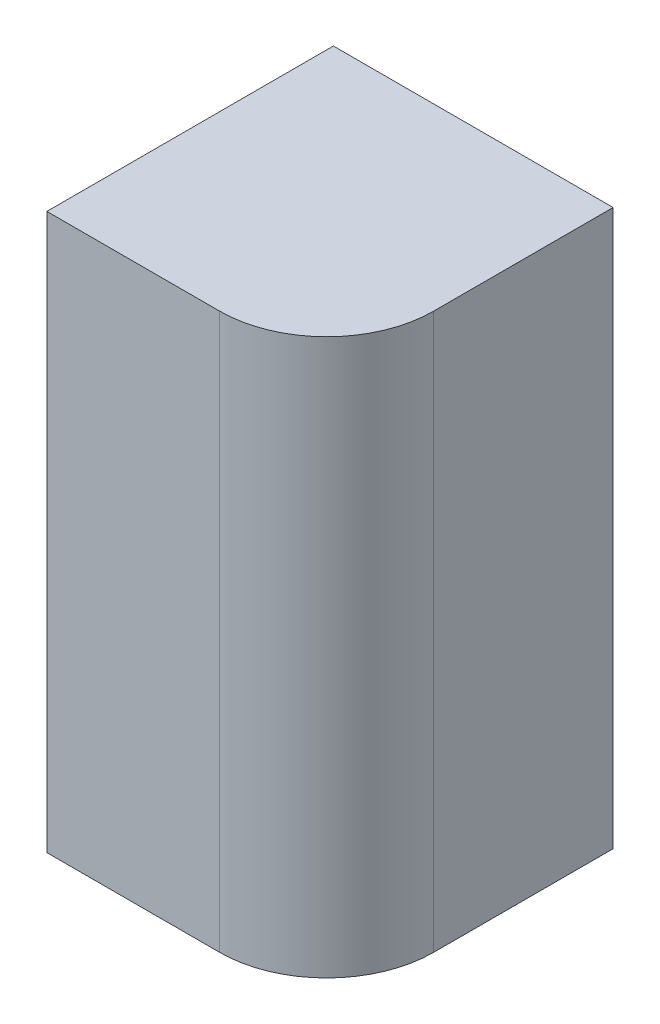
ISO-10303-21;
HEADER;
FILE_DESCRIPTION(('STEP AP214'),'2;1');
FILE_NAME('part.step','',(''),(''),'','','');
FILE_SCHEMA(('AUTOMOTIVE_DESIGN { 1 0 10303 214 1 1 1 1 }'));
ENDSEC;
DATA;
#1=APPLICATION_CONTEXT('core data for automotive mechanical design processes');
#2=APPLICATION_PROTOCOL_DEFINITION('international standard','automotive_design',2000,#1);
#3=PRODUCT_CONTEXT('',#1,'mechanical');
#4=PRODUCT('Part','Part','',(#3));
#5=PRODUCT_RELATED_PRODUCT_CATEGORY('part','',(#4));
#6=PRODUCT_DEFINITION_FORMATION('','',#4);
#7=PRODUCT_DEFINITION_CONTEXT('part definition',#1,'design');
#8=PRODUCT_DEFINITION('design','',#6,#7);
#9=PRODUCT_DEFINITION_SHAPE('','',#8);
#10=(LENGTH_UNIT() NAMED_UNIT(*) SI_UNIT(.MILLI.,.METRE.));
#11=(NAMED_UNIT(*) PLANE_ANGLE_UNIT() SI_UNIT($,.RADIAN.));
#12=(NAMED_UNIT(*) SI_UNIT($,.STERADIAN.) SOLID_ANGLE_UNIT());
#13=UNCERTAINTY_MEASURE_WITH_UNIT(LENGTH_MEASURE(1.E-05),#10,'distance_accuracy_value','');
#14=(GEOMETRIC_REPRESENTATION_CONTEXT(3) GLOBAL_UNCERTAINTY_ASSIGNED_CONTEXT((#13)) GLOBAL_UNIT_ASSIGNED_CONTEXT((#10,
#11,#12)) REPRESENTATION_CONTEXT('',''));
#15=CARTESIAN_POINT('',(0.,0.,0.));
#16=DIRECTION('',(0.,0.,1.));
#17=DIRECTION('',(1.,0.,0.));
#18=AXIS2_PLACEMENT_3D('',#15,#16,#17);
#19=CARTESIAN_POINT('',(0.,-254.76,-88.8626827799735));
#20=DIRECTION('',(0.,0.,1.));
#21=DIRECTION('',(1.,0.,0.));
#22=AXIS2_PLACEMENT_3D('',#19,#20,#21);
#23=PLANE('',#22);
#24=DIRECTION('',(0.,1.,0.));
#25=VECTOR('',#24,1.);
#26=CARTESIAN_POINT('',(-441.892965136227,-254.76,-88.8626827799734));
#27=LINE('',#26,#25);
#28=CARTESIAN_POINT('',(-441.892965136227,-5.,-88.8626827799735));
#29=VERTEX_POINT('',#28);
#30=CARTESIAN_POINT('',(-441.892965136227,-254.76,-88.8626827799734));
#31=VERTEX_POINT('',#30);
#32=EDGE_CURVE('E85',#29,#31,#27,.F.);
#33=ORIENTED_EDGE('',*,*,#32,.T.);
#34=DIRECTION('',(1.,0.,0.));
#35=VECTOR('',#34,1.);
#36=CARTESIAN_POINT('',(0.,-254.76,-88.8626827799734));
#37=LINE('',#36,#35);
#38=CARTESIAN_POINT('',(-522.744616305301,-254.76,-88.8626827799734));
#39=VERTEX_POINT('',#38);
#40=EDGE_CURVE('E226',#31,#39,#37,.F.);
#41=ORIENTED_EDGE('',*,*,#40,.T.);
#42=DIRECTION('',(0.,1.,0.));
#43=VECTOR('',#42,1.);
#44=CARTESIAN_POINT('',(-522.744616305301,-254.76,-88.8626827799735));
#45=LINE('',#44,#43);
#46=CARTESIAN_POINT('',(-522.744616305301,-5.,-88.8626827799735));
#47=VERTEX_POINT('',#46);
#48=EDGE_CURVE('E220',#47,#39,#45,.F.);
#49=ORIENTED_EDGE('',*,*,#48,.F.);
#50=DIRECTION('',(1.,0.,0.));
#51=VECTOR('',#50,1.);
#52=CARTESIAN_POINT('',(-441.892965136227,-5.,-88.8626827799735));
#53=LINE('',#52,#51);
#54=EDGE_CURVE('E105',#47,#29,#53,.T.);
#55=ORIENTED_EDGE('',*,*,#54,.T.);
#56=EDGE_LOOP('',(#33,#41,#49,#55));
#57=FACE_BOUND('',#56,.T.);
#58=ADVANCED_FACE('F17',(#57),#23,.F.);
#59=CARTESIAN_POINT('',(-441.892965136227,-254.76,-133.862682779973));
#60=DIRECTION('',(0.,1.,0.));
#61=DIRECTION('',(0.,0.,1.));
#62=AXIS2_PLACEMENT_3D('',#59,#60,#61);
#63=CYLINDRICAL_SURFACE('',#62,44.9999999999999);
#64=DIRECTION('',(0.,1.,0.));
#65=VECTOR('',#64,1.);
#66=CARTESIAN_POINT('',(-396.892965136227,-254.76,-133.862682779973));
#67=LINE('',#66,#65);
#68=CARTESIAN_POINT('',(-396.892965136227,-5.,-133.862682779973));
#69=VERTEX_POINT('',#68);
#70=CARTESIAN_POINT('',(-396.892965136227,-254.76,-133.862682779973));
#71=VERTEX_POINT('',#70);
#72=EDGE_CURVE('E91',#69,#71,#67,.F.);
#73=ORIENTED_EDGE('',*,*,#72,.T.);
#74=CARTESIAN_POINT('',(-441.892965136227,-254.76,-133.862682779973));
#75=DIRECTION('',(0.,1.,0.));
#76=DIRECTION('',(0.,0.,1.));
#77=AXIS2_PLACEMENT_3D('',#74,#75,#76);
#78=CIRCLE('',#77,44.9999999999999);
#79=EDGE_CURVE('E275',#71,#31,#78,.F.);
#80=ORIENTED_EDGE('',*,*,#79,.T.);
#81=ORIENTED_EDGE('',*,*,#32,.F.);
#82=CARTESIAN_POINT('',(-441.892965136227,-5.,-133.862682779973));
#83=DIRECTION('',(0.,1.,0.));
#84=DIRECTION('',(0.,0.,1.));
#85=AXIS2_PLACEMENT_3D('',#82,#83,#84);
#86=CIRCLE('',#85,44.9999999999999);
#87=EDGE_CURVE('E20',#29,#69,#86,.T.);
#88=ORIENTED_EDGE('',*,*,#87,.T.);
#89=EDGE_LOOP('',(#73,#80,#81,#88));
#90=FACE_BOUND('',#89,.T.);
#91=ADVANCED_FACE('F107',(#90),#63,.F.);
#92=CARTESIAN_POINT('',(0.,-254.76,-83.8626827799735));
#93=DIRECTION('',(0.,0.,1.));
#94=DIRECTION('',(1.,0.,0.));
#95=AXIS2_PLACEMENT_3D('',#92,#93,#94);
#96=PLANE('',#95);
#97=DIRECTION('',(0.,1.,0.));
#98=VECTOR('',#97,1.);
#99=CARTESIAN_POINT('',(-522.744616305301,-254.76,-83.8626827799734));
#100=LINE('',#99,#98);
#101=CARTESIAN_POINT('',(-522.744616305301,-254.76,-83.8626827799734));
#102=VERTEX_POINT('',#101);
#103=CARTESIAN_POINT('',(-522.744616305301,5.,-83.8626827799734));
#104=VERTEX_POINT('',#103);
#105=EDGE_CURVE('E259',#102,#104,#100,.T.);
#106=ORIENTED_EDGE('',*,*,#105,.F.);
#107=DIRECTION('',(1.,0.,0.));
#108=VECTOR('',#107,1.);
#109=CARTESIAN_POINT('',(0.,-254.76,-83.8626827799734));
#110=LINE('',#109,#108);
#111=CARTESIAN_POINT('',(-441.892965136227,-254.76,-83.8626827799734));
#112=VERTEX_POINT('',#111);
#113=EDGE_CURVE('E231',#102,#112,#110,.T.);
#114=ORIENTED_EDGE('',*,*,#113,.T.);
#115=DIRECTION('',(0.,1.,0.));
#116=VECTOR('',#115,1.);
#117=CARTESIAN_POINT('',(-441.892965136227,-254.76,-83.8626827799734));
#118=LINE('',#117,#116);
#119=CARTESIAN_POINT('',(-441.892965136227,5.,-83.8626827799734));
#120=VERTEX_POINT('',#119);
#121=EDGE_CURVE('E273',#120,#112,#118,.F.);
#122=ORIENTED_EDGE('',*,*,#121,.F.);
#123=DIRECTION('',(1.,0.,0.));
#124=VECTOR('',#123,1.);
#125=CARTESIAN_POINT('',(-441.892965136227,5.,-83.8626827799734));
#126=LINE('',#125,#124);
#127=EDGE_CURVE('E250',#104,#120,#126,.T.);
#128=ORIENTED_EDGE('',*,*,#127,.F.);
#129=EDGE_LOOP('',(#106,#114,#122,#128));
#130=FACE_BOUND('',#129,.T.);
#131=ADVANCED_FACE('F109',(#130),#96,.T.);
#132=CARTESIAN_POINT('',(-396.892965136227,-254.76,0.));
#133=DIRECTION('',(1.,0.,0.));
#134=DIRECTION('',(0.,0.,-1.));
#135=AXIS2_PLACEMENT_3D('',#132,#133,#134);
#136=PLANE('',#135);
#137=DIRECTION('',(0.,1.,0.));
#138=VECTOR('',#137,1.);
#139=CARTESIAN_POINT('',(-396.892965136227,0.,-217.862682779973));
#140=LINE('',#139,#138);
#141=CARTESIAN_POINT('',(-396.892965136227,-254.76,-217.862682779973));
#142=VERTEX_POINT('',#141);
#143=CARTESIAN_POINT('',(-396.892965136227,-5.,-217.862682779973));
#144=VERTEX_POINT('',#143);
#145=EDGE_CURVE('E243',#142,#144,#140,.T.);
#146=ORIENTED_EDGE('',*,*,#145,.F.);
#147=DIRECTION('',(0.,0.,1.));
#148=VECTOR('',#147,1.);
#149=CARTESIAN_POINT('',(-396.892965136227,-254.76,0.));
#150=LINE('',#149,#148);
#151=EDGE_CURVE('E97',#142,#71,#150,.T.);
#152=ORIENTED_EDGE('',*,*,#151,.T.);
#153=ORIENTED_EDGE('',*,*,#72,.F.);
#154=DIRECTION('',(0.,0.,1.));
#155=VECTOR('',#154,1.);
#156=CARTESIAN_POINT('',(-396.892965136227,-5.,-133.862682779973));
#157=LINE('',#156,#155);
#158=EDGE_CURVE('E95',#69,#144,#157,.F.);
#159=ORIENTED_EDGE('',*,*,#158,.T.);
#160=EDGE_LOOP('',(#146,#152,#153,#159));
#161=FACE_BOUND('',#160,.T.);
#162=ADVANCED_FACE('F94',(#161),#136,.F.);
#163=CARTESIAN_POINT('',(-441.892965136227,-5.,-133.862682779973));
#164=DIRECTION('',(0.,1.,0.));
#165=DIRECTION('',(0.,0.,1.));
#166=AXIS2_PLACEMENT_3D('',#163,#164,#165);
#167=PLANE('',#166);
#168=DIRECTION('',(0.,0.,1.));
#169=VECTOR('',#168,1.);
#170=CARTESIAN_POINT('',(-522.744616305301,-5.,0.));
#171=LINE('',#170,#169);
#172=CARTESIAN_POINT('',(-522.744616305301,-5.,-217.862682779973));
#173=VERTEX_POINT('',#172);
#174=EDGE_CURVE('E224',#173,#47,#171,.T.);
#175=ORIENTED_EDGE('',*,*,#174,.F.);
#176=DIRECTION('',(-1.,0.,0.));
#177=VECTOR('',#176,1.);
#178=CARTESIAN_POINT('',(0.,-5.,-217.862682779973));
#179=LINE('',#178,#177);
#180=EDGE_CURVE('E104',#144,#173,#179,.T.);
#181=ORIENTED_EDGE('',*,*,#180,.F.);
#182=ORIENTED_EDGE('',*,*,#158,.F.);
#183=ORIENTED_EDGE('',*,*,#87,.F.);
#184=ORIENTED_EDGE('',*,*,#54,.F.);
#185=EDGE_LOOP('',(#175,#181,#182,#183,#184));
#186=FACE_BOUND('',#185,.T.);
#187=ADVANCED_FACE('F102',(#186),#167,.F.);
#188=CARTESIAN_POINT('',(-522.744616305301,-254.76,0.));
#189=DIRECTION('',(-1.,0.,0.));
#190=DIRECTION('',(0.,0.,1.));
#191=AXIS2_PLACEMENT_3D('',#188,#189,#190);
#192=PLANE('',#191);
#193=ORIENTED_EDGE('',*,*,#48,.T.);
#194=DIRECTION('',(0.,0.,1.));
#195=VECTOR('',#194,1.);
#196=CARTESIAN_POINT('',(-522.744616305301,-254.76,0.));
#197=LINE('',#196,#195);
#198=EDGE_CURVE('E222',#39,#102,#197,.T.);
#199=ORIENTED_EDGE('',*,*,#198,.T.);
#200=ORIENTED_EDGE('',*,*,#105,.T.);
#201=DIRECTION('',(0.,0.,1.));
#202=VECTOR('',#201,1.);
#203=CARTESIAN_POINT('',(-522.744616305301,5.,-133.862682779973));
#204=LINE('',#203,#202);
#205=CARTESIAN_POINT('',(-522.744616305301,5.,-217.862682779973));
#206=VERTEX_POINT('',#205);
#207=EDGE_CURVE('E247',#206,#104,#204,.T.);
#208=ORIENTED_EDGE('',*,*,#207,.F.);
#209=DIRECTION('',(0.,1.,0.));
#210=VECTOR('',#209,1.);
#211=CARTESIAN_POINT('',(-522.744616305301,0.,-217.862682779973));
#212=LINE('',#211,#210);
#213=EDGE_CURVE('E254',#173,#206,#212,.T.);
#214=ORIENTED_EDGE('',*,*,#213,.F.);
#215=ORIENTED_EDGE('',*,*,#174,.T.);
#216=EDGE_LOOP('',(#193,#199,#200,#208,#214,#215));
#217=FACE_BOUND('',#216,.T.);
#218=ADVANCED_FACE('F140',(#217),#192,.T.);
#219=CARTESIAN_POINT('',(0.,-254.76,0.));
#220=DIRECTION('',(0.,1.,0.));
#221=DIRECTION('',(0.,0.,1.));
#222=AXIS2_PLACEMENT_3D('',#219,#220,#221);
#223=PLANE('',#222);
#224=ORIENTED_EDGE('',*,*,#151,.F.);
#225=DIRECTION('',(-1.,0.,0.));
#226=VECTOR('',#225,1.);
#227=CARTESIAN_POINT('',(0.,-254.76,-217.862682779973));
#228=LINE('',#227,#226);
#229=CARTESIAN_POINT('',(-391.892965136227,-254.76,-217.862682779973));
#230=VERTEX_POINT('',#229);
#231=EDGE_CURVE('E240',#230,#142,#228,.T.);
#232=ORIENTED_EDGE('',*,*,#231,.F.);
#233=DIRECTION('',(0.,0.,1.));
#234=VECTOR('',#233,1.);
#235=CARTESIAN_POINT('',(-391.892965136227,-254.76,0.));
#236=LINE('',#235,#234);
#237=CARTESIAN_POINT('',(-391.892965136227,-254.76,-133.862682779973));
#238=VERTEX_POINT('',#237);
#239=EDGE_CURVE('E291',#230,#238,#236,.T.);
#240=ORIENTED_EDGE('',*,*,#239,.T.);
#241=CARTESIAN_POINT('',(-441.892965136227,-254.76,-133.862682779973));
#242=DIRECTION('',(0.,1.,0.));
#243=DIRECTION('',(0.,0.,1.));
#244=AXIS2_PLACEMENT_3D('',#241,#242,#243);
#245=CIRCLE('',#244,49.9999999999999);
#246=EDGE_CURVE('E251',#112,#238,#245,.T.);
#247=ORIENTED_EDGE('',*,*,#246,.F.);
#248=ORIENTED_EDGE('',*,*,#113,.F.);
#249=ORIENTED_EDGE('',*,*,#198,.F.);
#250=ORIENTED_EDGE('',*,*,#40,.F.);
#251=ORIENTED_EDGE('',*,*,#79,.F.);
#252=EDGE_LOOP('',(#224,#232,#240,#247,#248,#249,#250,#251));
#253=FACE_BOUND('',#252,.T.);
#254=ADVANCED_FACE('F136',(#253),#223,.F.);
#255=CARTESIAN_POINT('',(-441.892965136227,-254.76,-133.862682779973));
#256=DIRECTION('',(0.,1.,0.));
#257=DIRECTION('',(0.,0.,1.));
#258=AXIS2_PLACEMENT_3D('',#255,#256,#257);
#259=CYLINDRICAL_SURFACE('',#258,49.9999999999999);
#260=ORIENTED_EDGE('',*,*,#121,.T.);
#261=ORIENTED_EDGE('',*,*,#246,.T.);
#262=DIRECTION('',(0.,1.,0.));
#263=VECTOR('',#262,1.);
#264=CARTESIAN_POINT('',(-391.892965136227,-254.76,-133.862682779973));
#265=LINE('',#264,#263);
#266=CARTESIAN_POINT('',(-391.892965136227,5.,-133.862682779973));
#267=VERTEX_POINT('',#266);
#268=EDGE_CURVE('E294',#238,#267,#265,.T.);
#269=ORIENTED_EDGE('',*,*,#268,.T.);
#270=CARTESIAN_POINT('',(-441.892965136227,5.,-133.862682779973));
#271=DIRECTION('',(0.,1.,0.));
#272=DIRECTION('',(0.,0.,1.));
#273=AXIS2_PLACEMENT_3D('',#270,#271,#272);
#274=CIRCLE('',#273,49.9999999999999);
#275=EDGE_CURVE('E244',#120,#267,#274,.T.);
#276=ORIENTED_EDGE('',*,*,#275,.F.);
#277=EDGE_LOOP('',(#260,#261,#269,#276));
#278=FACE_BOUND('',#277,.T.);
#279=ADVANCED_FACE('F132',(#278),#259,.T.);
#280=CARTESIAN_POINT('',(-441.892965136227,5.,-133.862682779973));
#281=DIRECTION('',(0.,1.,0.));
#282=DIRECTION('',(0.,0.,1.));
#283=AXIS2_PLACEMENT_3D('',#280,#281,#282);
#284=PLANE('',#283);
#285=ORIENTED_EDGE('',*,*,#275,.T.);
#286=DIRECTION('',(0.,0.,1.));
#287=VECTOR('',#286,1.);
#288=CARTESIAN_POINT('',(-391.892965136227,5.,0.));
#289=LINE('',#288,#287);
#290=CARTESIAN_POINT('',(-391.892965136227,5.,-217.862682779973));
#291=VERTEX_POINT('',#290);
#292=EDGE_CURVE('E26',#267,#291,#289,.F.);
#293=ORIENTED_EDGE('',*,*,#292,.T.);
#294=DIRECTION('',(-1.,0.,0.));
#295=VECTOR('',#294,1.);
#296=CARTESIAN_POINT('',(0.,5.,-217.862682779973));
#297=LINE('',#296,#295);
#298=EDGE_CURVE('E34',#206,#291,#297,.F.);
#299=ORIENTED_EDGE('',*,*,#298,.F.);
#300=ORIENTED_EDGE('',*,*,#207,.T.);
#301=ORIENTED_EDGE('',*,*,#127,.T.);
#302=EDGE_LOOP('',(#285,#293,#299,#300,#301));
#303=FACE_BOUND('',#302,.T.);
#304=ADVANCED_FACE('F126',(#303),#284,.T.);
#305=CARTESIAN_POINT('',(0.,0.,-217.862682779973));
#306=DIRECTION('',(0.,0.,-1.));
#307=DIRECTION('',(-1.,0.,0.));
#308=AXIS2_PLACEMENT_3D('',#305,#306,#307);
#309=PLANE('',#308);
#310=ORIENTED_EDGE('',*,*,#213,.T.);
#311=ORIENTED_EDGE('',*,*,#298,.T.);
#312=DIRECTION('',(0.,1.,0.));
#313=VECTOR('',#312,1.);
#314=CARTESIAN_POINT('',(-391.892965136227,-254.76,-217.862682779973));
#315=LINE('',#314,#313);
#316=EDGE_CURVE('E11',#291,#230,#315,.F.);
#317=ORIENTED_EDGE('',*,*,#316,.T.);
#318=ORIENTED_EDGE('',*,*,#231,.T.);
#319=ORIENTED_EDGE('',*,*,#145,.T.);
#320=ORIENTED_EDGE('',*,*,#180,.T.);
#321=EDGE_LOOP('',(#310,#311,#317,#318,#319,#320));
#322=FACE_BOUND('',#321,.T.);
#323=ADVANCED_FACE('F120',(#322),#309,.T.);
#324=CARTESIAN_POINT('',(-391.892965136227,-254.76,0.));
#325=DIRECTION('',(-1.,0.,0.));
#326=DIRECTION('',(0.,0.,1.));
#327=AXIS2_PLACEMENT_3D('',#324,#325,#326);
#328=PLANE('',#327);
#329=ORIENTED_EDGE('',*,*,#292,.F.);
#330=ORIENTED_EDGE('',*,*,#268,.F.);
#331=ORIENTED_EDGE('',*,*,#239,.F.);
#332=ORIENTED_EDGE('',*,*,#316,.F.);
#333=EDGE_LOOP('',(#329,#330,#331,#332));
#334=FACE_BOUND('',#333,.T.);
#335=ADVANCED_FACE('F118',(#334),#328,.F.);
#336=CLOSED_SHELL('',(#58,#91,#131,#162,#187,#218,#254,#279,#304,#323,#335));
#337=MANIFOLD_SOLID_BREP('B1',#336);
#338=ADVANCED_BREP_SHAPE_REPRESENTATION('',(#18,#337),#14);
#339=SHAPE_DEFINITION_REPRESENTATION(#9,#338);
ENDSEC;
END-ISO-10303-21;
